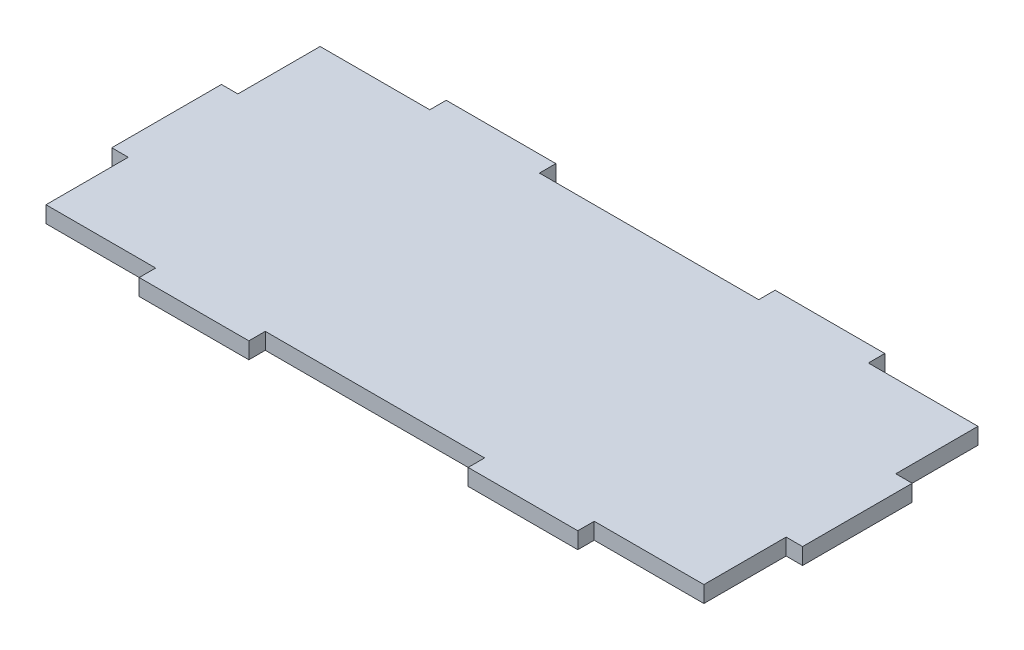
ISO-10303-21;
HEADER;
FILE_DESCRIPTION(('STEP AP214'),'2;1');
FILE_NAME('part.step','',(''),(''),'','','');
FILE_SCHEMA(('AUTOMOTIVE_DESIGN { 1 0 10303 214 1 1 1 1 }'));
ENDSEC;
DATA;
#1=APPLICATION_CONTEXT('core data for automotive mechanical design processes');
#2=APPLICATION_PROTOCOL_DEFINITION('international standard','automotive_design',2000,#1);
#3=PRODUCT_CONTEXT('',#1,'mechanical');
#4=PRODUCT('Part','Part','',(#3));
#5=PRODUCT_RELATED_PRODUCT_CATEGORY('part','',(#4));
#6=PRODUCT_DEFINITION_FORMATION('','',#4);
#7=PRODUCT_DEFINITION_CONTEXT('part definition',#1,'design');
#8=PRODUCT_DEFINITION('design','',#6,#7);
#9=PRODUCT_DEFINITION_SHAPE('','',#8);
#10=(LENGTH_UNIT() NAMED_UNIT(*) SI_UNIT(.MILLI.,.METRE.));
#11=(NAMED_UNIT(*) PLANE_ANGLE_UNIT() SI_UNIT($,.RADIAN.));
#12=(NAMED_UNIT(*) SI_UNIT($,.STERADIAN.) SOLID_ANGLE_UNIT());
#13=UNCERTAINTY_MEASURE_WITH_UNIT(LENGTH_MEASURE(1.E-05),#10,'distance_accuracy_value','');
#14=(GEOMETRIC_REPRESENTATION_CONTEXT(3) GLOBAL_UNCERTAINTY_ASSIGNED_CONTEXT((#13)) GLOBAL_UNIT_ASSIGNED_CONTEXT((#10,
#11,#12)) REPRESENTATION_CONTEXT('',''));
#15=CARTESIAN_POINT('',(0.,0.,0.));
#16=DIRECTION('',(0.,0.,1.));
#17=DIRECTION('',(1.,0.,0.));
#18=AXIS2_PLACEMENT_3D('',#15,#16,#17);
#19=CARTESIAN_POINT('',(0.,3.,0.));
#20=DIRECTION('',(1.,0.,0.));
#21=DIRECTION('',(0.,0.,-1.));
#22=AXIS2_PLACEMENT_3D('',#19,#20,#21);
#23=PLANE('',#22);
#24=DIRECTION('',(0.,0.,1.));
#25=VECTOR('',#24,1.);
#26=CARTESIAN_POINT('',(0.,0.,0.));
#27=LINE('',#26,#25);
#28=CARTESIAN_POINT('',(0.,0.,-15.));
#29=VERTEX_POINT('',#28);
#30=CARTESIAN_POINT('',(0.,0.,0.));
#31=VERTEX_POINT('',#30);
#32=EDGE_CURVE('E254',#29,#31,#27,.T.);
#33=ORIENTED_EDGE('',*,*,#32,.T.);
#34=DIRECTION('',(0.,-1.,0.));
#35=VECTOR('',#34,1.);
#36=CARTESIAN_POINT('',(0.,3.,0.));
#37=LINE('',#36,#35);
#38=CARTESIAN_POINT('',(0.,3.,0.));
#39=VERTEX_POINT('',#38);
#40=EDGE_CURVE('E11',#39,#31,#37,.T.);
#41=ORIENTED_EDGE('',*,*,#40,.F.);
#42=DIRECTION('',(0.,0.,1.));
#43=VECTOR('',#42,1.);
#44=CARTESIAN_POINT('',(0.,3.,0.));
#45=LINE('',#44,#43);
#46=CARTESIAN_POINT('',(0.,3.,-15.));
#47=VERTEX_POINT('',#46);
#48=EDGE_CURVE('E308',#47,#39,#45,.T.);
#49=ORIENTED_EDGE('',*,*,#48,.F.);
#50=DIRECTION('',(0.,-1.,0.));
#51=VECTOR('',#50,1.);
#52=CARTESIAN_POINT('',(0.,3.,-15.));
#53=LINE('',#52,#51);
#54=EDGE_CURVE('E250',#47,#29,#53,.T.);
#55=ORIENTED_EDGE('',*,*,#54,.T.);
#56=EDGE_LOOP('',(#33,#41,#49,#55));
#57=FACE_BOUND('',#56,.T.);
#58=ADVANCED_FACE('F38',(#57),#23,.F.);
#59=CARTESIAN_POINT('',(0.,3.,0.));
#60=DIRECTION('',(0.,0.,-1.));
#61=DIRECTION('',(-1.,0.,0.));
#62=AXIS2_PLACEMENT_3D('',#59,#60,#61);
#63=PLANE('',#62);
#64=DIRECTION('',(1.,0.,0.));
#65=VECTOR('',#64,1.);
#66=CARTESIAN_POINT('',(0.,0.,0.));
#67=LINE('',#66,#65);
#68=CARTESIAN_POINT('',(20.,0.,0.));
#69=VERTEX_POINT('',#68);
#70=EDGE_CURVE('E257',#31,#69,#67,.T.);
#71=ORIENTED_EDGE('',*,*,#70,.T.);
#72=DIRECTION('',(0.,-1.,0.));
#73=VECTOR('',#72,1.);
#74=CARTESIAN_POINT('',(20.,3.,0.));
#75=LINE('',#74,#73);
#76=CARTESIAN_POINT('',(20.,3.,0.));
#77=VERTEX_POINT('',#76);
#78=EDGE_CURVE('E46',#77,#69,#75,.T.);
#79=ORIENTED_EDGE('',*,*,#78,.F.);
#80=DIRECTION('',(1.,0.,0.));
#81=VECTOR('',#80,1.);
#82=CARTESIAN_POINT('',(0.,3.,0.));
#83=LINE('',#82,#81);
#84=EDGE_CURVE('E157',#39,#77,#83,.T.);
#85=ORIENTED_EDGE('',*,*,#84,.F.);
#86=ORIENTED_EDGE('',*,*,#40,.T.);
#87=EDGE_LOOP('',(#71,#79,#85,#86));
#88=FACE_BOUND('',#87,.T.);
#89=ADVANCED_FACE('F466',(#88),#63,.F.);
#90=CARTESIAN_POINT('',(20.,3.,3.00000000000001));
#91=DIRECTION('',(1.,0.,0.));
#92=DIRECTION('',(0.,0.,-1.));
#93=AXIS2_PLACEMENT_3D('',#90,#91,#92);
#94=PLANE('',#93);
#95=DIRECTION('',(0.,0.,1.));
#96=VECTOR('',#95,1.);
#97=CARTESIAN_POINT('',(20.,0.,3.00000000000001));
#98=LINE('',#97,#96);
#99=CARTESIAN_POINT('',(20.,0.,3.00000000000001));
#100=VERTEX_POINT('',#99);
#101=EDGE_CURVE('E259',#69,#100,#98,.T.);
#102=ORIENTED_EDGE('',*,*,#101,.T.);
#103=DIRECTION('',(0.,-1.,0.));
#104=VECTOR('',#103,1.);
#105=CARTESIAN_POINT('',(20.,3.,3.00000000000001));
#106=LINE('',#105,#104);
#107=CARTESIAN_POINT('',(20.,3.,3.00000000000001));
#108=VERTEX_POINT('',#107);
#109=EDGE_CURVE('E375',#108,#100,#106,.T.);
#110=ORIENTED_EDGE('',*,*,#109,.F.);
#111=DIRECTION('',(0.,0.,1.));
#112=VECTOR('',#111,1.);
#113=CARTESIAN_POINT('',(20.,3.,3.00000000000001));
#114=LINE('',#113,#112);
#115=EDGE_CURVE('E383',#77,#108,#114,.T.);
#116=ORIENTED_EDGE('',*,*,#115,.F.);
#117=ORIENTED_EDGE('',*,*,#78,.T.);
#118=EDGE_LOOP('',(#102,#110,#116,#117));
#119=FACE_BOUND('',#118,.T.);
#120=ADVANCED_FACE('F381',(#119),#94,.F.);
#121=CARTESIAN_POINT('',(20.,3.,3.00000000000001));
#122=DIRECTION('',(0.,0.,-1.));
#123=DIRECTION('',(-1.,0.,0.));
#124=AXIS2_PLACEMENT_3D('',#121,#122,#123);
#125=PLANE('',#124);
#126=DIRECTION('',(1.,0.,0.));
#127=VECTOR('',#126,1.);
#128=CARTESIAN_POINT('',(20.,0.,3.00000000000001));
#129=LINE('',#128,#127);
#130=CARTESIAN_POINT('',(40.,0.,3.00000000000001));
#131=VERTEX_POINT('',#130);
#132=EDGE_CURVE('E261',#100,#131,#129,.T.);
#133=ORIENTED_EDGE('',*,*,#132,.T.);
#134=DIRECTION('',(0.,-1.,0.));
#135=VECTOR('',#134,1.);
#136=CARTESIAN_POINT('',(40.,3.,3.00000000000001));
#137=LINE('',#136,#135);
#138=CARTESIAN_POINT('',(40.,3.,3.00000000000001));
#139=VERTEX_POINT('',#138);
#140=EDGE_CURVE('E372',#139,#131,#137,.T.);
#141=ORIENTED_EDGE('',*,*,#140,.F.);
#142=DIRECTION('',(1.,0.,0.));
#143=VECTOR('',#142,1.);
#144=CARTESIAN_POINT('',(20.,3.,3.00000000000001));
#145=LINE('',#144,#143);
#146=EDGE_CURVE('E401',#108,#139,#145,.T.);
#147=ORIENTED_EDGE('',*,*,#146,.F.);
#148=ORIENTED_EDGE('',*,*,#109,.T.);
#149=EDGE_LOOP('',(#133,#141,#147,#148));
#150=FACE_BOUND('',#149,.T.);
#151=ADVANCED_FACE('F392',(#150),#125,.F.);
#152=CARTESIAN_POINT('',(40.,3.,3.00000000000001));
#153=DIRECTION('',(-1.,0.,0.));
#154=DIRECTION('',(0.,0.,1.));
#155=AXIS2_PLACEMENT_3D('',#152,#153,#154);
#156=PLANE('',#155);
#157=DIRECTION('',(0.,0.,-1.));
#158=VECTOR('',#157,1.);
#159=CARTESIAN_POINT('',(40.,0.,3.00000000000001));
#160=LINE('',#159,#158);
#161=CARTESIAN_POINT('',(40.,0.,0.));
#162=VERTEX_POINT('',#161);
#163=EDGE_CURVE('E263',#131,#162,#160,.T.);
#164=ORIENTED_EDGE('',*,*,#163,.T.);
#165=DIRECTION('',(0.,-1.,0.));
#166=VECTOR('',#165,1.);
#167=CARTESIAN_POINT('',(40.,3.,0.));
#168=LINE('',#167,#166);
#169=CARTESIAN_POINT('',(40.,3.,0.));
#170=VERTEX_POINT('',#169);
#171=EDGE_CURVE('E369',#170,#162,#168,.T.);
#172=ORIENTED_EDGE('',*,*,#171,.F.);
#173=DIRECTION('',(0.,0.,-1.));
#174=VECTOR('',#173,1.);
#175=CARTESIAN_POINT('',(40.,3.,3.00000000000001));
#176=LINE('',#175,#174);
#177=EDGE_CURVE('E398',#139,#170,#176,.T.);
#178=ORIENTED_EDGE('',*,*,#177,.F.);
#179=ORIENTED_EDGE('',*,*,#140,.T.);
#180=EDGE_LOOP('',(#164,#172,#178,#179));
#181=FACE_BOUND('',#180,.T.);
#182=ADVANCED_FACE('F396',(#181),#156,.F.);
#183=CARTESIAN_POINT('',(40.,3.,0.));
#184=DIRECTION('',(0.,0.,-1.));
#185=DIRECTION('',(-1.,0.,0.));
#186=AXIS2_PLACEMENT_3D('',#183,#184,#185);
#187=PLANE('',#186);
#188=DIRECTION('',(1.,0.,0.));
#189=VECTOR('',#188,1.);
#190=CARTESIAN_POINT('',(40.,0.,0.));
#191=LINE('',#190,#189);
#192=CARTESIAN_POINT('',(80.,0.,0.));
#193=VERTEX_POINT('',#192);
#194=EDGE_CURVE('E265',#162,#193,#191,.T.);
#195=ORIENTED_EDGE('',*,*,#194,.T.);
#196=DIRECTION('',(0.,-1.,0.));
#197=VECTOR('',#196,1.);
#198=CARTESIAN_POINT('',(80.,3.,0.));
#199=LINE('',#198,#197);
#200=CARTESIAN_POINT('',(80.,3.,0.));
#201=VERTEX_POINT('',#200);
#202=EDGE_CURVE('E366',#201,#193,#199,.T.);
#203=ORIENTED_EDGE('',*,*,#202,.F.);
#204=DIRECTION('',(1.,0.,0.));
#205=VECTOR('',#204,1.);
#206=CARTESIAN_POINT('',(40.,3.,0.));
#207=LINE('',#206,#205);
#208=EDGE_CURVE('E400',#170,#201,#207,.T.);
#209=ORIENTED_EDGE('',*,*,#208,.F.);
#210=ORIENTED_EDGE('',*,*,#171,.T.);
#211=EDGE_LOOP('',(#195,#203,#209,#210));
#212=FACE_BOUND('',#211,.T.);
#213=ADVANCED_FACE('F479',(#212),#187,.F.);
#214=CARTESIAN_POINT('',(80.,3.,3.00000000000001));
#215=DIRECTION('',(1.,0.,0.));
#216=DIRECTION('',(0.,0.,-1.));
#217=AXIS2_PLACEMENT_3D('',#214,#215,#216);
#218=PLANE('',#217);
#219=DIRECTION('',(0.,0.,1.));
#220=VECTOR('',#219,1.);
#221=CARTESIAN_POINT('',(80.,0.,3.00000000000001));
#222=LINE('',#221,#220);
#223=CARTESIAN_POINT('',(80.,0.,3.00000000000001));
#224=VERTEX_POINT('',#223);
#225=EDGE_CURVE('E267',#193,#224,#222,.T.);
#226=ORIENTED_EDGE('',*,*,#225,.T.);
#227=DIRECTION('',(0.,-1.,0.));
#228=VECTOR('',#227,1.);
#229=CARTESIAN_POINT('',(80.,3.,3.00000000000001));
#230=LINE('',#229,#228);
#231=CARTESIAN_POINT('',(80.,3.,3.00000000000001));
#232=VERTEX_POINT('',#231);
#233=EDGE_CURVE('E363',#232,#224,#230,.T.);
#234=ORIENTED_EDGE('',*,*,#233,.F.);
#235=DIRECTION('',(0.,0.,1.));
#236=VECTOR('',#235,1.);
#237=CARTESIAN_POINT('',(80.,3.,3.00000000000001));
#238=LINE('',#237,#236);
#239=EDGE_CURVE('E403',#201,#232,#238,.T.);
#240=ORIENTED_EDGE('',*,*,#239,.F.);
#241=ORIENTED_EDGE('',*,*,#202,.T.);
#242=EDGE_LOOP('',(#226,#234,#240,#241));
#243=FACE_BOUND('',#242,.T.);
#244=ADVANCED_FACE('F482',(#243),#218,.F.);
#245=CARTESIAN_POINT('',(100.,3.,3.00000000000001));
#246=DIRECTION('',(0.,0.,-1.));
#247=DIRECTION('',(-1.,0.,0.));
#248=AXIS2_PLACEMENT_3D('',#245,#246,#247);
#249=PLANE('',#248);
#250=DIRECTION('',(1.,0.,0.));
#251=VECTOR('',#250,1.);
#252=CARTESIAN_POINT('',(100.,0.,3.00000000000001));
#253=LINE('',#252,#251);
#254=CARTESIAN_POINT('',(100.,0.,3.00000000000001));
#255=VERTEX_POINT('',#254);
#256=EDGE_CURVE('E269',#224,#255,#253,.T.);
#257=ORIENTED_EDGE('',*,*,#256,.T.);
#258=DIRECTION('',(0.,-1.,0.));
#259=VECTOR('',#258,1.);
#260=CARTESIAN_POINT('',(100.,3.,3.00000000000001));
#261=LINE('',#260,#259);
#262=CARTESIAN_POINT('',(100.,3.,3.00000000000001));
#263=VERTEX_POINT('',#262);
#264=EDGE_CURVE('E360',#263,#255,#261,.T.);
#265=ORIENTED_EDGE('',*,*,#264,.F.);
#266=DIRECTION('',(1.,0.,0.));
#267=VECTOR('',#266,1.);
#268=CARTESIAN_POINT('',(100.,3.,3.00000000000001));
#269=LINE('',#268,#267);
#270=EDGE_CURVE('E409',#232,#263,#269,.T.);
#271=ORIENTED_EDGE('',*,*,#270,.F.);
#272=ORIENTED_EDGE('',*,*,#233,.T.);
#273=EDGE_LOOP('',(#257,#265,#271,#272));
#274=FACE_BOUND('',#273,.T.);
#275=ADVANCED_FACE('F486',(#274),#249,.F.);
#276=CARTESIAN_POINT('',(100.,3.,3.00000000000001));
#277=DIRECTION('',(-1.,0.,0.));
#278=DIRECTION('',(0.,0.,1.));
#279=AXIS2_PLACEMENT_3D('',#276,#277,#278);
#280=PLANE('',#279);
#281=DIRECTION('',(0.,0.,-1.));
#282=VECTOR('',#281,1.);
#283=CARTESIAN_POINT('',(100.,0.,3.00000000000001));
#284=LINE('',#283,#282);
#285=CARTESIAN_POINT('',(100.,0.,0.));
#286=VERTEX_POINT('',#285);
#287=EDGE_CURVE('E271',#255,#286,#284,.T.);
#288=ORIENTED_EDGE('',*,*,#287,.T.);
#289=DIRECTION('',(0.,-1.,0.));
#290=VECTOR('',#289,1.);
#291=CARTESIAN_POINT('',(100.,3.,0.));
#292=LINE('',#291,#290);
#293=CARTESIAN_POINT('',(100.,3.,0.));
#294=VERTEX_POINT('',#293);
#295=EDGE_CURVE('E357',#294,#286,#292,.T.);
#296=ORIENTED_EDGE('',*,*,#295,.F.);
#297=DIRECTION('',(0.,0.,-1.));
#298=VECTOR('',#297,1.);
#299=CARTESIAN_POINT('',(100.,3.,3.00000000000001));
#300=LINE('',#299,#298);
#301=EDGE_CURVE('E411',#263,#294,#300,.T.);
#302=ORIENTED_EDGE('',*,*,#301,.F.);
#303=ORIENTED_EDGE('',*,*,#264,.T.);
#304=EDGE_LOOP('',(#288,#296,#302,#303));
#305=FACE_BOUND('',#304,.T.);
#306=ADVANCED_FACE('F490',(#305),#280,.F.);
#307=CARTESIAN_POINT('',(100.,3.,0.));
#308=DIRECTION('',(0.,0.,-1.));
#309=DIRECTION('',(-1.,0.,0.));
#310=AXIS2_PLACEMENT_3D('',#307,#308,#309);
#311=PLANE('',#310);
#312=DIRECTION('',(1.,0.,0.));
#313=VECTOR('',#312,1.);
#314=CARTESIAN_POINT('',(100.,0.,0.));
#315=LINE('',#314,#313);
#316=CARTESIAN_POINT('',(120.,0.,0.));
#317=VERTEX_POINT('',#316);
#318=EDGE_CURVE('E273',#286,#317,#315,.T.);
#319=ORIENTED_EDGE('',*,*,#318,.T.);
#320=DIRECTION('',(0.,-1.,0.));
#321=VECTOR('',#320,1.);
#322=CARTESIAN_POINT('',(120.,3.,0.));
#323=LINE('',#322,#321);
#324=CARTESIAN_POINT('',(120.,3.,0.));
#325=VERTEX_POINT('',#324);
#326=EDGE_CURVE('E354',#325,#317,#323,.T.);
#327=ORIENTED_EDGE('',*,*,#326,.F.);
#328=DIRECTION('',(1.,0.,0.));
#329=VECTOR('',#328,1.);
#330=CARTESIAN_POINT('',(100.,3.,0.));
#331=LINE('',#330,#329);
#332=EDGE_CURVE('E413',#294,#325,#331,.T.);
#333=ORIENTED_EDGE('',*,*,#332,.F.);
#334=ORIENTED_EDGE('',*,*,#295,.T.);
#335=EDGE_LOOP('',(#319,#327,#333,#334));
#336=FACE_BOUND('',#335,.T.);
#337=ADVANCED_FACE('F494',(#336),#311,.F.);
#338=CARTESIAN_POINT('',(120.,3.,0.));
#339=DIRECTION('',(-1.,0.,0.));
#340=DIRECTION('',(0.,0.,1.));
#341=AXIS2_PLACEMENT_3D('',#338,#339,#340);
#342=PLANE('',#341);
#343=DIRECTION('',(0.,0.,-1.));
#344=VECTOR('',#343,1.);
#345=CARTESIAN_POINT('',(120.,0.,0.));
#346=LINE('',#345,#344);
#347=CARTESIAN_POINT('',(120.,0.,-15.));
#348=VERTEX_POINT('',#347);
#349=EDGE_CURVE('E275',#317,#348,#346,.T.);
#350=ORIENTED_EDGE('',*,*,#349,.T.);
#351=DIRECTION('',(0.,-1.,0.));
#352=VECTOR('',#351,1.);
#353=CARTESIAN_POINT('',(120.,3.,-15.));
#354=LINE('',#353,#352);
#355=CARTESIAN_POINT('',(120.,3.,-15.));
#356=VERTEX_POINT('',#355);
#357=EDGE_CURVE('E351',#356,#348,#354,.T.);
#358=ORIENTED_EDGE('',*,*,#357,.F.);
#359=DIRECTION('',(0.,0.,-1.));
#360=VECTOR('',#359,1.);
#361=CARTESIAN_POINT('',(120.,3.,0.));
#362=LINE('',#361,#360);
#363=EDGE_CURVE('E415',#325,#356,#362,.T.);
#364=ORIENTED_EDGE('',*,*,#363,.F.);
#365=ORIENTED_EDGE('',*,*,#326,.T.);
#366=EDGE_LOOP('',(#350,#358,#364,#365));
#367=FACE_BOUND('',#366,.T.);
#368=ADVANCED_FACE('F498',(#367),#342,.F.);
#369=CARTESIAN_POINT('',(120.,3.,-15.));
#370=DIRECTION('',(0.,0.,-1.));
#371=DIRECTION('',(-1.,0.,0.));
#372=AXIS2_PLACEMENT_3D('',#369,#370,#371);
#373=PLANE('',#372);
#374=DIRECTION('',(1.,0.,0.));
#375=VECTOR('',#374,1.);
#376=CARTESIAN_POINT('',(120.,0.,-15.));
#377=LINE('',#376,#375);
#378=CARTESIAN_POINT('',(123.,0.,-15.));
#379=VERTEX_POINT('',#378);
#380=EDGE_CURVE('E277',#348,#379,#377,.T.);
#381=ORIENTED_EDGE('',*,*,#380,.T.);
#382=DIRECTION('',(0.,-1.,0.));
#383=VECTOR('',#382,1.);
#384=CARTESIAN_POINT('',(123.,3.,-15.));
#385=LINE('',#384,#383);
#386=CARTESIAN_POINT('',(123.,3.,-15.));
#387=VERTEX_POINT('',#386);
#388=EDGE_CURVE('E348',#387,#379,#385,.T.);
#389=ORIENTED_EDGE('',*,*,#388,.F.);
#390=DIRECTION('',(1.,0.,0.));
#391=VECTOR('',#390,1.);
#392=CARTESIAN_POINT('',(120.,3.,-15.));
#393=LINE('',#392,#391);
#394=EDGE_CURVE('E417',#356,#387,#393,.T.);
#395=ORIENTED_EDGE('',*,*,#394,.F.);
#396=ORIENTED_EDGE('',*,*,#357,.T.);
#397=EDGE_LOOP('',(#381,#389,#395,#396));
#398=FACE_BOUND('',#397,.T.);
#399=ADVANCED_FACE('F502',(#398),#373,.F.);
#400=CARTESIAN_POINT('',(123.,3.,-15.));
#401=DIRECTION('',(-1.,0.,0.));
#402=DIRECTION('',(0.,0.,1.));
#403=AXIS2_PLACEMENT_3D('',#400,#401,#402);
#404=PLANE('',#403);
#405=DIRECTION('',(0.,0.,-1.));
#406=VECTOR('',#405,1.);
#407=CARTESIAN_POINT('',(123.,0.,-15.));
#408=LINE('',#407,#406);
#409=CARTESIAN_POINT('',(123.,0.,-35.));
#410=VERTEX_POINT('',#409);
#411=EDGE_CURVE('E279',#379,#410,#408,.T.);
#412=ORIENTED_EDGE('',*,*,#411,.T.);
#413=DIRECTION('',(0.,-1.,0.));
#414=VECTOR('',#413,1.);
#415=CARTESIAN_POINT('',(123.,3.,-35.));
#416=LINE('',#415,#414);
#417=CARTESIAN_POINT('',(123.,3.,-35.));
#418=VERTEX_POINT('',#417);
#419=EDGE_CURVE('E345',#418,#410,#416,.T.);
#420=ORIENTED_EDGE('',*,*,#419,.F.);
#421=DIRECTION('',(0.,0.,-1.));
#422=VECTOR('',#421,1.);
#423=CARTESIAN_POINT('',(123.,3.,-15.));
#424=LINE('',#423,#422);
#425=EDGE_CURVE('E419',#387,#418,#424,.T.);
#426=ORIENTED_EDGE('',*,*,#425,.F.);
#427=ORIENTED_EDGE('',*,*,#388,.T.);
#428=EDGE_LOOP('',(#412,#420,#426,#427));
#429=FACE_BOUND('',#428,.T.);
#430=ADVANCED_FACE('F506',(#429),#404,.F.);
#431=CARTESIAN_POINT('',(120.,3.,-35.));
#432=DIRECTION('',(0.,0.,1.));
#433=DIRECTION('',(1.,0.,0.));
#434=AXIS2_PLACEMENT_3D('',#431,#432,#433);
#435=PLANE('',#434);
#436=DIRECTION('',(-1.,0.,0.));
#437=VECTOR('',#436,1.);
#438=CARTESIAN_POINT('',(120.,0.,-35.));
#439=LINE('',#438,#437);
#440=CARTESIAN_POINT('',(120.,0.,-35.));
#441=VERTEX_POINT('',#440);
#442=EDGE_CURVE('E281',#410,#441,#439,.T.);
#443=ORIENTED_EDGE('',*,*,#442,.T.);
#444=DIRECTION('',(0.,-1.,0.));
#445=VECTOR('',#444,1.);
#446=CARTESIAN_POINT('',(120.,3.,-35.));
#447=LINE('',#446,#445);
#448=CARTESIAN_POINT('',(120.,3.,-35.));
#449=VERTEX_POINT('',#448);
#450=EDGE_CURVE('E342',#449,#441,#447,.T.);
#451=ORIENTED_EDGE('',*,*,#450,.F.);
#452=DIRECTION('',(-1.,0.,0.));
#453=VECTOR('',#452,1.);
#454=CARTESIAN_POINT('',(120.,3.,-35.));
#455=LINE('',#454,#453);
#456=EDGE_CURVE('E421',#418,#449,#455,.T.);
#457=ORIENTED_EDGE('',*,*,#456,.F.);
#458=ORIENTED_EDGE('',*,*,#419,.T.);
#459=EDGE_LOOP('',(#443,#451,#457,#458));
#460=FACE_BOUND('',#459,.T.);
#461=ADVANCED_FACE('F510',(#460),#435,.F.);
#462=CARTESIAN_POINT('',(120.,3.,-35.));
#463=DIRECTION('',(-1.,0.,0.));
#464=DIRECTION('',(0.,0.,1.));
#465=AXIS2_PLACEMENT_3D('',#462,#463,#464);
#466=PLANE('',#465);
#467=DIRECTION('',(0.,0.,-1.));
#468=VECTOR('',#467,1.);
#469=CARTESIAN_POINT('',(120.,0.,-35.));
#470=LINE('',#469,#468);
#471=CARTESIAN_POINT('',(120.,0.,-50.));
#472=VERTEX_POINT('',#471);
#473=EDGE_CURVE('E283',#441,#472,#470,.T.);
#474=ORIENTED_EDGE('',*,*,#473,.T.);
#475=DIRECTION('',(0.,-1.,0.));
#476=VECTOR('',#475,1.);
#477=CARTESIAN_POINT('',(120.,3.,-50.));
#478=LINE('',#477,#476);
#479=CARTESIAN_POINT('',(120.,3.,-50.));
#480=VERTEX_POINT('',#479);
#481=EDGE_CURVE('E339',#480,#472,#478,.T.);
#482=ORIENTED_EDGE('',*,*,#481,.F.);
#483=DIRECTION('',(0.,0.,-1.));
#484=VECTOR('',#483,1.);
#485=CARTESIAN_POINT('',(120.,3.,-35.));
#486=LINE('',#485,#484);
#487=EDGE_CURVE('E423',#449,#480,#486,.T.);
#488=ORIENTED_EDGE('',*,*,#487,.F.);
#489=ORIENTED_EDGE('',*,*,#450,.T.);
#490=EDGE_LOOP('',(#474,#482,#488,#489));
#491=FACE_BOUND('',#490,.T.);
#492=ADVANCED_FACE('F514',(#491),#466,.F.);
#493=CARTESIAN_POINT('',(100.,3.,-50.));
#494=DIRECTION('',(0.,0.,1.));
#495=DIRECTION('',(1.,0.,0.));
#496=AXIS2_PLACEMENT_3D('',#493,#494,#495);
#497=PLANE('',#496);
#498=DIRECTION('',(-1.,0.,0.));
#499=VECTOR('',#498,1.);
#500=CARTESIAN_POINT('',(100.,0.,-50.));
#501=LINE('',#500,#499);
#502=CARTESIAN_POINT('',(100.,0.,-50.));
#503=VERTEX_POINT('',#502);
#504=EDGE_CURVE('E285',#472,#503,#501,.T.);
#505=ORIENTED_EDGE('',*,*,#504,.T.);
#506=DIRECTION('',(0.,-1.,0.));
#507=VECTOR('',#506,1.);
#508=CARTESIAN_POINT('',(100.,3.,-50.));
#509=LINE('',#508,#507);
#510=CARTESIAN_POINT('',(100.,3.,-50.));
#511=VERTEX_POINT('',#510);
#512=EDGE_CURVE('E336',#511,#503,#509,.T.);
#513=ORIENTED_EDGE('',*,*,#512,.F.);
#514=DIRECTION('',(-1.,0.,0.));
#515=VECTOR('',#514,1.);
#516=CARTESIAN_POINT('',(100.,3.,-50.));
#517=LINE('',#516,#515);
#518=EDGE_CURVE('E425',#480,#511,#517,.T.);
#519=ORIENTED_EDGE('',*,*,#518,.F.);
#520=ORIENTED_EDGE('',*,*,#481,.T.);
#521=EDGE_LOOP('',(#505,#513,#519,#520));
#522=FACE_BOUND('',#521,.T.);
#523=ADVANCED_FACE('F518',(#522),#497,.F.);
#524=CARTESIAN_POINT('',(100.,3.,-53.));
#525=DIRECTION('',(-1.,0.,0.));
#526=DIRECTION('',(0.,0.,1.));
#527=AXIS2_PLACEMENT_3D('',#524,#525,#526);
#528=PLANE('',#527);
#529=DIRECTION('',(0.,0.,-1.));
#530=VECTOR('',#529,1.);
#531=CARTESIAN_POINT('',(100.,0.,-53.));
#532=LINE('',#531,#530);
#533=CARTESIAN_POINT('',(100.,0.,-53.));
#534=VERTEX_POINT('',#533);
#535=EDGE_CURVE('E287',#503,#534,#532,.T.);
#536=ORIENTED_EDGE('',*,*,#535,.T.);
#537=DIRECTION('',(0.,-1.,0.));
#538=VECTOR('',#537,1.);
#539=CARTESIAN_POINT('',(100.,3.,-53.));
#540=LINE('',#539,#538);
#541=CARTESIAN_POINT('',(100.,3.,-53.));
#542=VERTEX_POINT('',#541);
#543=EDGE_CURVE('E333',#542,#534,#540,.T.);
#544=ORIENTED_EDGE('',*,*,#543,.F.);
#545=DIRECTION('',(0.,0.,-1.));
#546=VECTOR('',#545,1.);
#547=CARTESIAN_POINT('',(100.,3.,-53.));
#548=LINE('',#547,#546);
#549=EDGE_CURVE('E427',#511,#542,#548,.T.);
#550=ORIENTED_EDGE('',*,*,#549,.F.);
#551=ORIENTED_EDGE('',*,*,#512,.T.);
#552=EDGE_LOOP('',(#536,#544,#550,#551));
#553=FACE_BOUND('',#552,.T.);
#554=ADVANCED_FACE('F522',(#553),#528,.F.);
#555=CARTESIAN_POINT('',(100.,3.,-53.));
#556=DIRECTION('',(0.,0.,1.));
#557=DIRECTION('',(1.,0.,0.));
#558=AXIS2_PLACEMENT_3D('',#555,#556,#557);
#559=PLANE('',#558);
#560=DIRECTION('',(-1.,0.,0.));
#561=VECTOR('',#560,1.);
#562=CARTESIAN_POINT('',(100.,0.,-53.));
#563=LINE('',#562,#561);
#564=CARTESIAN_POINT('',(80.,0.,-53.));
#565=VERTEX_POINT('',#564);
#566=EDGE_CURVE('E289',#534,#565,#563,.T.);
#567=ORIENTED_EDGE('',*,*,#566,.T.);
#568=DIRECTION('',(0.,-1.,0.));
#569=VECTOR('',#568,1.);
#570=CARTESIAN_POINT('',(80.,3.,-53.));
#571=LINE('',#570,#569);
#572=CARTESIAN_POINT('',(80.,3.,-53.));
#573=VERTEX_POINT('',#572);
#574=EDGE_CURVE('E330',#573,#565,#571,.T.);
#575=ORIENTED_EDGE('',*,*,#574,.F.);
#576=DIRECTION('',(-1.,0.,0.));
#577=VECTOR('',#576,1.);
#578=CARTESIAN_POINT('',(100.,3.,-53.));
#579=LINE('',#578,#577);
#580=EDGE_CURVE('E429',#542,#573,#579,.T.);
#581=ORIENTED_EDGE('',*,*,#580,.F.);
#582=ORIENTED_EDGE('',*,*,#543,.T.);
#583=EDGE_LOOP('',(#567,#575,#581,#582));
#584=FACE_BOUND('',#583,.T.);
#585=ADVANCED_FACE('F526',(#584),#559,.F.);
#586=CARTESIAN_POINT('',(80.,3.,-53.));
#587=DIRECTION('',(1.,0.,0.));
#588=DIRECTION('',(0.,0.,-1.));
#589=AXIS2_PLACEMENT_3D('',#586,#587,#588);
#590=PLANE('',#589);
#591=DIRECTION('',(0.,0.,1.));
#592=VECTOR('',#591,1.);
#593=CARTESIAN_POINT('',(80.,0.,-53.));
#594=LINE('',#593,#592);
#595=CARTESIAN_POINT('',(80.,0.,-50.));
#596=VERTEX_POINT('',#595);
#597=EDGE_CURVE('E291',#565,#596,#594,.T.);
#598=ORIENTED_EDGE('',*,*,#597,.T.);
#599=DIRECTION('',(0.,-1.,0.));
#600=VECTOR('',#599,1.);
#601=CARTESIAN_POINT('',(80.,3.,-50.));
#602=LINE('',#601,#600);
#603=CARTESIAN_POINT('',(80.,3.,-50.));
#604=VERTEX_POINT('',#603);
#605=EDGE_CURVE('E327',#604,#596,#602,.T.);
#606=ORIENTED_EDGE('',*,*,#605,.F.);
#607=DIRECTION('',(0.,0.,1.));
#608=VECTOR('',#607,1.);
#609=CARTESIAN_POINT('',(80.,3.,-53.));
#610=LINE('',#609,#608);
#611=EDGE_CURVE('E431',#573,#604,#610,.T.);
#612=ORIENTED_EDGE('',*,*,#611,.F.);
#613=ORIENTED_EDGE('',*,*,#574,.T.);
#614=EDGE_LOOP('',(#598,#606,#612,#613));
#615=FACE_BOUND('',#614,.T.);
#616=ADVANCED_FACE('F530',(#615),#590,.F.);
#617=CARTESIAN_POINT('',(40.,3.,-50.));
#618=DIRECTION('',(0.,0.,1.));
#619=DIRECTION('',(1.,0.,0.));
#620=AXIS2_PLACEMENT_3D('',#617,#618,#619);
#621=PLANE('',#620);
#622=DIRECTION('',(-1.,0.,0.));
#623=VECTOR('',#622,1.);
#624=CARTESIAN_POINT('',(40.,0.,-50.));
#625=LINE('',#624,#623);
#626=CARTESIAN_POINT('',(40.,0.,-50.));
#627=VERTEX_POINT('',#626);
#628=EDGE_CURVE('E293',#596,#627,#625,.T.);
#629=ORIENTED_EDGE('',*,*,#628,.T.);
#630=DIRECTION('',(0.,-1.,0.));
#631=VECTOR('',#630,1.);
#632=CARTESIAN_POINT('',(40.,3.,-50.));
#633=LINE('',#632,#631);
#634=CARTESIAN_POINT('',(40.,3.,-50.));
#635=VERTEX_POINT('',#634);
#636=EDGE_CURVE('E324',#635,#627,#633,.T.);
#637=ORIENTED_EDGE('',*,*,#636,.F.);
#638=DIRECTION('',(-1.,0.,0.));
#639=VECTOR('',#638,1.);
#640=CARTESIAN_POINT('',(40.,3.,-50.));
#641=LINE('',#640,#639);
#642=EDGE_CURVE('E433',#604,#635,#641,.T.);
#643=ORIENTED_EDGE('',*,*,#642,.F.);
#644=ORIENTED_EDGE('',*,*,#605,.T.);
#645=EDGE_LOOP('',(#629,#637,#643,#644));
#646=FACE_BOUND('',#645,.T.);
#647=ADVANCED_FACE('F534',(#646),#621,.F.);
#648=CARTESIAN_POINT('',(40.,3.,-53.));
#649=DIRECTION('',(-1.,0.,0.));
#650=DIRECTION('',(0.,0.,1.));
#651=AXIS2_PLACEMENT_3D('',#648,#649,#650);
#652=PLANE('',#651);
#653=DIRECTION('',(0.,0.,-1.));
#654=VECTOR('',#653,1.);
#655=CARTESIAN_POINT('',(40.,0.,-53.));
#656=LINE('',#655,#654);
#657=CARTESIAN_POINT('',(40.,0.,-53.));
#658=VERTEX_POINT('',#657);
#659=EDGE_CURVE('E295',#627,#658,#656,.T.);
#660=ORIENTED_EDGE('',*,*,#659,.T.);
#661=DIRECTION('',(0.,-1.,0.));
#662=VECTOR('',#661,1.);
#663=CARTESIAN_POINT('',(40.,3.,-53.));
#664=LINE('',#663,#662);
#665=CARTESIAN_POINT('',(40.,3.,-53.));
#666=VERTEX_POINT('',#665);
#667=EDGE_CURVE('E321',#666,#658,#664,.T.);
#668=ORIENTED_EDGE('',*,*,#667,.F.);
#669=DIRECTION('',(0.,0.,-1.));
#670=VECTOR('',#669,1.);
#671=CARTESIAN_POINT('',(40.,3.,-53.));
#672=LINE('',#671,#670);
#673=EDGE_CURVE('E435',#635,#666,#672,.T.);
#674=ORIENTED_EDGE('',*,*,#673,.F.);
#675=ORIENTED_EDGE('',*,*,#636,.T.);
#676=EDGE_LOOP('',(#660,#668,#674,#675));
#677=FACE_BOUND('',#676,.T.);
#678=ADVANCED_FACE('F538',(#677),#652,.F.);
#679=CARTESIAN_POINT('',(20.,3.,-53.));
#680=DIRECTION('',(0.,0.,1.));
#681=DIRECTION('',(1.,0.,0.));
#682=AXIS2_PLACEMENT_3D('',#679,#680,#681);
#683=PLANE('',#682);
#684=DIRECTION('',(-1.,0.,0.));
#685=VECTOR('',#684,1.);
#686=CARTESIAN_POINT('',(20.,0.,-53.));
#687=LINE('',#686,#685);
#688=CARTESIAN_POINT('',(20.,0.,-53.));
#689=VERTEX_POINT('',#688);
#690=EDGE_CURVE('E297',#658,#689,#687,.T.);
#691=ORIENTED_EDGE('',*,*,#690,.T.);
#692=DIRECTION('',(0.,-1.,0.));
#693=VECTOR('',#692,1.);
#694=CARTESIAN_POINT('',(20.,3.,-53.));
#695=LINE('',#694,#693);
#696=CARTESIAN_POINT('',(20.,3.,-53.));
#697=VERTEX_POINT('',#696);
#698=EDGE_CURVE('E318',#697,#689,#695,.T.);
#699=ORIENTED_EDGE('',*,*,#698,.F.);
#700=DIRECTION('',(-1.,0.,0.));
#701=VECTOR('',#700,1.);
#702=CARTESIAN_POINT('',(20.,3.,-53.));
#703=LINE('',#702,#701);
#704=EDGE_CURVE('E437',#666,#697,#703,.T.);
#705=ORIENTED_EDGE('',*,*,#704,.F.);
#706=ORIENTED_EDGE('',*,*,#667,.T.);
#707=EDGE_LOOP('',(#691,#699,#705,#706));
#708=FACE_BOUND('',#707,.T.);
#709=ADVANCED_FACE('F542',(#708),#683,.F.);
#710=CARTESIAN_POINT('',(20.,3.,-53.));
#711=DIRECTION('',(1.,0.,0.));
#712=DIRECTION('',(0.,0.,-1.));
#713=AXIS2_PLACEMENT_3D('',#710,#711,#712);
#714=PLANE('',#713);
#715=DIRECTION('',(0.,0.,1.));
#716=VECTOR('',#715,1.);
#717=CARTESIAN_POINT('',(20.,0.,-53.));
#718=LINE('',#717,#716);
#719=CARTESIAN_POINT('',(20.,0.,-50.));
#720=VERTEX_POINT('',#719);
#721=EDGE_CURVE('E299',#689,#720,#718,.T.);
#722=ORIENTED_EDGE('',*,*,#721,.T.);
#723=DIRECTION('',(0.,-1.,0.));
#724=VECTOR('',#723,1.);
#725=CARTESIAN_POINT('',(20.,3.,-50.));
#726=LINE('',#725,#724);
#727=CARTESIAN_POINT('',(20.,3.,-50.));
#728=VERTEX_POINT('',#727);
#729=EDGE_CURVE('E315',#728,#720,#726,.T.);
#730=ORIENTED_EDGE('',*,*,#729,.F.);
#731=DIRECTION('',(0.,0.,1.));
#732=VECTOR('',#731,1.);
#733=CARTESIAN_POINT('',(20.,3.,-53.));
#734=LINE('',#733,#732);
#735=EDGE_CURVE('E439',#697,#728,#734,.T.);
#736=ORIENTED_EDGE('',*,*,#735,.F.);
#737=ORIENTED_EDGE('',*,*,#698,.T.);
#738=EDGE_LOOP('',(#722,#730,#736,#737));
#739=FACE_BOUND('',#738,.T.);
#740=ADVANCED_FACE('F546',(#739),#714,.F.);
#741=CARTESIAN_POINT('',(0.,3.,-50.));
#742=DIRECTION('',(0.,0.,1.));
#743=DIRECTION('',(1.,0.,0.));
#744=AXIS2_PLACEMENT_3D('',#741,#742,#743);
#745=PLANE('',#744);
#746=DIRECTION('',(-1.,0.,0.));
#747=VECTOR('',#746,1.);
#748=CARTESIAN_POINT('',(0.,0.,-50.));
#749=LINE('',#748,#747);
#750=CARTESIAN_POINT('',(0.,0.,-50.));
#751=VERTEX_POINT('',#750);
#752=EDGE_CURVE('E301',#720,#751,#749,.T.);
#753=ORIENTED_EDGE('',*,*,#752,.T.);
#754=DIRECTION('',(0.,-1.,0.));
#755=VECTOR('',#754,1.);
#756=CARTESIAN_POINT('',(0.,3.,-50.));
#757=LINE('',#756,#755);
#758=CARTESIAN_POINT('',(0.,3.,-50.));
#759=VERTEX_POINT('',#758);
#760=EDGE_CURVE('E312',#759,#751,#757,.T.);
#761=ORIENTED_EDGE('',*,*,#760,.F.);
#762=DIRECTION('',(-1.,0.,0.));
#763=VECTOR('',#762,1.);
#764=CARTESIAN_POINT('',(0.,3.,-50.));
#765=LINE('',#764,#763);
#766=EDGE_CURVE('E441',#728,#759,#765,.T.);
#767=ORIENTED_EDGE('',*,*,#766,.F.);
#768=ORIENTED_EDGE('',*,*,#729,.T.);
#769=EDGE_LOOP('',(#753,#761,#767,#768));
#770=FACE_BOUND('',#769,.T.);
#771=ADVANCED_FACE('F447',(#770),#745,.F.);
#772=CARTESIAN_POINT('',(0.,3.,-35.));
#773=DIRECTION('',(1.,0.,0.));
#774=DIRECTION('',(0.,0.,-1.));
#775=AXIS2_PLACEMENT_3D('',#772,#773,#774);
#776=PLANE('',#775);
#777=DIRECTION('',(0.,0.,1.));
#778=VECTOR('',#777,1.);
#779=CARTESIAN_POINT('',(0.,0.,-35.));
#780=LINE('',#779,#778);
#781=CARTESIAN_POINT('',(0.,0.,-35.));
#782=VERTEX_POINT('',#781);
#783=EDGE_CURVE('E303',#751,#782,#780,.T.);
#784=ORIENTED_EDGE('',*,*,#783,.T.);
#785=DIRECTION('',(0.,-1.,0.));
#786=VECTOR('',#785,1.);
#787=CARTESIAN_POINT('',(0.,3.,-35.));
#788=LINE('',#787,#786);
#789=CARTESIAN_POINT('',(0.,3.,-35.));
#790=VERTEX_POINT('',#789);
#791=EDGE_CURVE('E245',#790,#782,#788,.T.);
#792=ORIENTED_EDGE('',*,*,#791,.F.);
#793=DIRECTION('',(0.,0.,1.));
#794=VECTOR('',#793,1.);
#795=CARTESIAN_POINT('',(0.,3.,-35.));
#796=LINE('',#795,#794);
#797=EDGE_CURVE('E236',#759,#790,#796,.T.);
#798=ORIENTED_EDGE('',*,*,#797,.F.);
#799=ORIENTED_EDGE('',*,*,#760,.T.);
#800=EDGE_LOOP('',(#784,#792,#798,#799));
#801=FACE_BOUND('',#800,.T.);
#802=ADVANCED_FACE('F451',(#801),#776,.F.);
#803=CARTESIAN_POINT('',(0.,3.,-35.));
#804=DIRECTION('',(0.,0.,1.));
#805=DIRECTION('',(1.,0.,0.));
#806=AXIS2_PLACEMENT_3D('',#803,#804,#805);
#807=PLANE('',#806);
#808=DIRECTION('',(-1.,0.,0.));
#809=VECTOR('',#808,1.);
#810=CARTESIAN_POINT('',(0.,0.,-35.));
#811=LINE('',#810,#809);
#812=CARTESIAN_POINT('',(-3.,0.,-35.));
#813=VERTEX_POINT('',#812);
#814=EDGE_CURVE('E244',#782,#813,#811,.T.);
#815=ORIENTED_EDGE('',*,*,#814,.T.);
#816=DIRECTION('',(0.,-1.,0.));
#817=VECTOR('',#816,1.);
#818=CARTESIAN_POINT('',(-3.,3.,-35.));
#819=LINE('',#818,#817);
#820=CARTESIAN_POINT('',(-3.,3.,-35.));
#821=VERTEX_POINT('',#820);
#822=EDGE_CURVE('E241',#821,#813,#819,.T.);
#823=ORIENTED_EDGE('',*,*,#822,.F.);
#824=DIRECTION('',(-1.,0.,0.));
#825=VECTOR('',#824,1.);
#826=CARTESIAN_POINT('',(0.,3.,-35.));
#827=LINE('',#826,#825);
#828=EDGE_CURVE('E230',#790,#821,#827,.T.);
#829=ORIENTED_EDGE('',*,*,#828,.F.);
#830=ORIENTED_EDGE('',*,*,#791,.T.);
#831=EDGE_LOOP('',(#815,#823,#829,#830));
#832=FACE_BOUND('',#831,.T.);
#833=ADVANCED_FACE('F242',(#832),#807,.F.);
#834=CARTESIAN_POINT('',(-3.,3.,-15.));
#835=DIRECTION('',(1.,0.,0.));
#836=DIRECTION('',(0.,0.,-1.));
#837=AXIS2_PLACEMENT_3D('',#834,#835,#836);
#838=PLANE('',#837);
#839=DIRECTION('',(0.,0.,1.));
#840=VECTOR('',#839,1.);
#841=CARTESIAN_POINT('',(-3.,0.,-15.));
#842=LINE('',#841,#840);
#843=CARTESIAN_POINT('',(-3.,0.,-15.));
#844=VERTEX_POINT('',#843);
#845=EDGE_CURVE('E143',#813,#844,#842,.T.);
#846=ORIENTED_EDGE('',*,*,#845,.T.);
#847=DIRECTION('',(0.,-1.,0.));
#848=VECTOR('',#847,1.);
#849=CARTESIAN_POINT('',(-3.,3.,-15.));
#850=LINE('',#849,#848);
#851=CARTESIAN_POINT('',(-3.,3.,-15.));
#852=VERTEX_POINT('',#851);
#853=EDGE_CURVE('E246',#852,#844,#850,.T.);
#854=ORIENTED_EDGE('',*,*,#853,.F.);
#855=DIRECTION('',(0.,0.,1.));
#856=VECTOR('',#855,1.);
#857=CARTESIAN_POINT('',(-3.,3.,-15.));
#858=LINE('',#857,#856);
#859=EDGE_CURVE('E234',#821,#852,#858,.T.);
#860=ORIENTED_EDGE('',*,*,#859,.F.);
#861=ORIENTED_EDGE('',*,*,#822,.T.);
#862=EDGE_LOOP('',(#846,#854,#860,#861));
#863=FACE_BOUND('',#862,.T.);
#864=ADVANCED_FACE('F248',(#863),#838,.F.);
#865=CARTESIAN_POINT('',(0.,3.,-15.));
#866=DIRECTION('',(0.,0.,-1.));
#867=DIRECTION('',(-1.,0.,0.));
#868=AXIS2_PLACEMENT_3D('',#865,#866,#867);
#869=PLANE('',#868);
#870=DIRECTION('',(1.,0.,0.));
#871=VECTOR('',#870,1.);
#872=CARTESIAN_POINT('',(0.,0.,-15.));
#873=LINE('',#872,#871);
#874=EDGE_CURVE('E149',#844,#29,#873,.T.);
#875=ORIENTED_EDGE('',*,*,#874,.T.);
#876=ORIENTED_EDGE('',*,*,#54,.F.);
#877=DIRECTION('',(1.,0.,0.));
#878=VECTOR('',#877,1.);
#879=CARTESIAN_POINT('',(0.,3.,-15.));
#880=LINE('',#879,#878);
#881=EDGE_CURVE('E54',#852,#47,#880,.T.);
#882=ORIENTED_EDGE('',*,*,#881,.F.);
#883=ORIENTED_EDGE('',*,*,#853,.T.);
#884=EDGE_LOOP('',(#875,#876,#882,#883));
#885=FACE_BOUND('',#884,.T.);
#886=ADVANCED_FACE('F455',(#885),#869,.F.);
#887=CARTESIAN_POINT('',(0.,3.,0.));
#888=DIRECTION('',(0.,1.,0.));
#889=DIRECTION('',(0.,0.,1.));
#890=AXIS2_PLACEMENT_3D('',#887,#888,#889);
#891=PLANE('',#890);
#892=ORIENTED_EDGE('',*,*,#48,.T.);
#893=ORIENTED_EDGE('',*,*,#84,.T.);
#894=ORIENTED_EDGE('',*,*,#115,.T.);
#895=ORIENTED_EDGE('',*,*,#146,.T.);
#896=ORIENTED_EDGE('',*,*,#177,.T.);
#897=ORIENTED_EDGE('',*,*,#208,.T.);
#898=ORIENTED_EDGE('',*,*,#239,.T.);
#899=ORIENTED_EDGE('',*,*,#270,.T.);
#900=ORIENTED_EDGE('',*,*,#301,.T.);
#901=ORIENTED_EDGE('',*,*,#332,.T.);
#902=ORIENTED_EDGE('',*,*,#363,.T.);
#903=ORIENTED_EDGE('',*,*,#394,.T.);
#904=ORIENTED_EDGE('',*,*,#425,.T.);
#905=ORIENTED_EDGE('',*,*,#456,.T.);
#906=ORIENTED_EDGE('',*,*,#487,.T.);
#907=ORIENTED_EDGE('',*,*,#518,.T.);
#908=ORIENTED_EDGE('',*,*,#549,.T.);
#909=ORIENTED_EDGE('',*,*,#580,.T.);
#910=ORIENTED_EDGE('',*,*,#611,.T.);
#911=ORIENTED_EDGE('',*,*,#642,.T.);
#912=ORIENTED_EDGE('',*,*,#673,.T.);
#913=ORIENTED_EDGE('',*,*,#704,.T.);
#914=ORIENTED_EDGE('',*,*,#735,.T.);
#915=ORIENTED_EDGE('',*,*,#766,.T.);
#916=ORIENTED_EDGE('',*,*,#797,.T.);
#917=ORIENTED_EDGE('',*,*,#828,.T.);
#918=ORIENTED_EDGE('',*,*,#859,.T.);
#919=ORIENTED_EDGE('',*,*,#881,.T.);
#920=EDGE_LOOP('',(#892,#893,#894,#895,#896,#897,#898,#899,#900,#901,#902,#903,#904,#905,#906,
#907,#908,#909,#910,#911,#912,#913,#914,#915,#916,#917,#918,#919));
#921=FACE_BOUND('',#920,.T.);
#922=ADVANCED_FACE('F232',(#921),#891,.T.);
#923=CARTESIAN_POINT('',(0.,0.,0.));
#924=DIRECTION('',(0.,1.,0.));
#925=DIRECTION('',(0.,0.,1.));
#926=AXIS2_PLACEMENT_3D('',#923,#924,#925);
#927=PLANE('',#926);
#928=ORIENTED_EDGE('',*,*,#32,.F.);
#929=ORIENTED_EDGE('',*,*,#874,.F.);
#930=ORIENTED_EDGE('',*,*,#845,.F.);
#931=ORIENTED_EDGE('',*,*,#814,.F.);
#932=ORIENTED_EDGE('',*,*,#783,.F.);
#933=ORIENTED_EDGE('',*,*,#752,.F.);
#934=ORIENTED_EDGE('',*,*,#721,.F.);
#935=ORIENTED_EDGE('',*,*,#690,.F.);
#936=ORIENTED_EDGE('',*,*,#659,.F.);
#937=ORIENTED_EDGE('',*,*,#628,.F.);
#938=ORIENTED_EDGE('',*,*,#597,.F.);
#939=ORIENTED_EDGE('',*,*,#566,.F.);
#940=ORIENTED_EDGE('',*,*,#535,.F.);
#941=ORIENTED_EDGE('',*,*,#504,.F.);
#942=ORIENTED_EDGE('',*,*,#473,.F.);
#943=ORIENTED_EDGE('',*,*,#442,.F.);
#944=ORIENTED_EDGE('',*,*,#411,.F.);
#945=ORIENTED_EDGE('',*,*,#380,.F.);
#946=ORIENTED_EDGE('',*,*,#349,.F.);
#947=ORIENTED_EDGE('',*,*,#318,.F.);
#948=ORIENTED_EDGE('',*,*,#287,.F.);
#949=ORIENTED_EDGE('',*,*,#256,.F.);
#950=ORIENTED_EDGE('',*,*,#225,.F.);
#951=ORIENTED_EDGE('',*,*,#194,.F.);
#952=ORIENTED_EDGE('',*,*,#163,.F.);
#953=ORIENTED_EDGE('',*,*,#132,.F.);
#954=ORIENTED_EDGE('',*,*,#101,.F.);
#955=ORIENTED_EDGE('',*,*,#70,.F.);
#956=EDGE_LOOP('',(#928,#929,#930,#931,#932,#933,#934,#935,#936,#937,#938,#939,#940,#941,#942,
#943,#944,#945,#946,#947,#948,#949,#950,#951,#952,#953,#954,#955));
#957=FACE_BOUND('',#956,.T.);
#958=ADVANCED_FACE('F387',(#957),#927,.F.);
#959=CLOSED_SHELL('',(#58,#89,#120,#151,#182,#213,#244,#275,#306,#337,#368,#399,#430,#461,#492,
#523,#554,#585,#616,#647,#678,#709,#740,#771,#802,#833,#864,#886,#922,#958));
#960=MANIFOLD_SOLID_BREP('B2',#959);
#961=ADVANCED_BREP_SHAPE_REPRESENTATION('',(#18,#960),#14);
#962=SHAPE_DEFINITION_REPRESENTATION(#9,#961);
ENDSEC;
END-ISO-10303-21;
